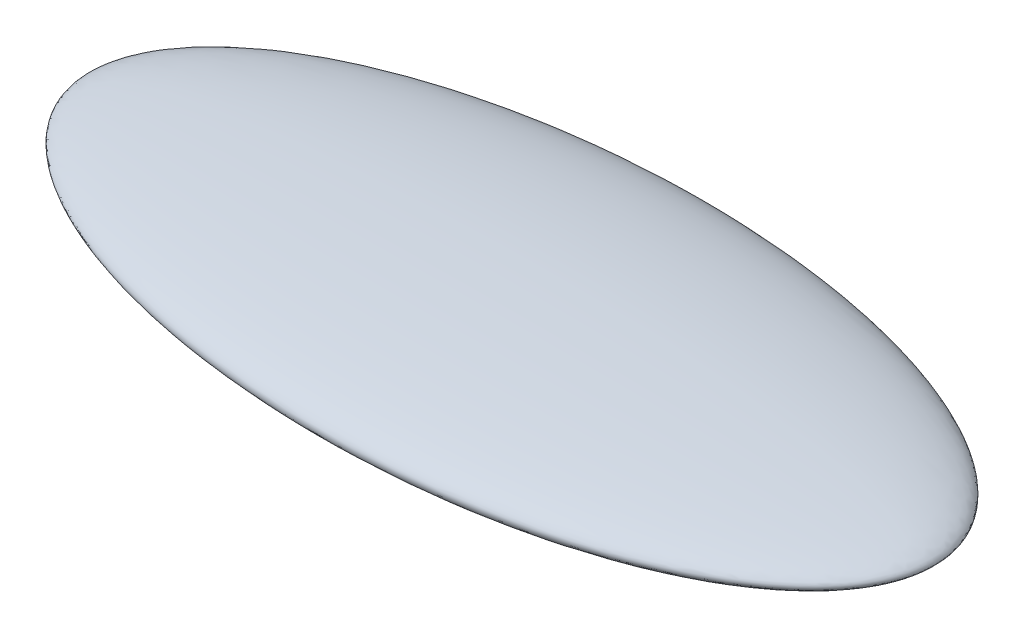
ISO-10303-21;
HEADER;
FILE_DESCRIPTION(('STEP AP214'),'2;1');
FILE_NAME('part.step','',(''),(''),'','','');
FILE_SCHEMA(('AUTOMOTIVE_DESIGN { 1 0 10303 214 1 1 1 1 }'));
ENDSEC;
DATA;
#1=APPLICATION_CONTEXT('core data for automotive mechanical design processes');
#2=APPLICATION_PROTOCOL_DEFINITION('international standard','automotive_design',2000,#1);
#3=PRODUCT_CONTEXT('',#1,'mechanical');
#4=PRODUCT('Part','Part','',(#3));
#5=PRODUCT_RELATED_PRODUCT_CATEGORY('part','',(#4));
#6=PRODUCT_DEFINITION_FORMATION('','',#4);
#7=PRODUCT_DEFINITION_CONTEXT('part definition',#1,'design');
#8=PRODUCT_DEFINITION('design','',#6,#7);
#9=PRODUCT_DEFINITION_SHAPE('','',#8);
#10=(LENGTH_UNIT() NAMED_UNIT(*) SI_UNIT(.MILLI.,.METRE.));
#11=(NAMED_UNIT(*) PLANE_ANGLE_UNIT() SI_UNIT($,.RADIAN.));
#12=(NAMED_UNIT(*) SI_UNIT($,.STERADIAN.) SOLID_ANGLE_UNIT());
#13=UNCERTAINTY_MEASURE_WITH_UNIT(LENGTH_MEASURE(1.E-05),#10,'distance_accuracy_value','');
#14=(GEOMETRIC_REPRESENTATION_CONTEXT(3) GLOBAL_UNCERTAINTY_ASSIGNED_CONTEXT((#13)) GLOBAL_UNIT_ASSIGNED_CONTEXT((#10,
#11,#12)) REPRESENTATION_CONTEXT('',''));
#15=CARTESIAN_POINT('',(0.,0.,0.));
#16=DIRECTION('',(0.,0.,1.));
#17=DIRECTION('',(1.,0.,0.));
#18=AXIS2_PLACEMENT_3D('',#15,#16,#17);
#19=CARTESIAN_POINT('',(0.,-46.5,88.));
#20=CARTESIAN_POINT('',(50.,-46.5,88.));
#21=CARTESIAN_POINT('',(50.,-46.5,111.));
#22=CARTESIAN_POINT('',(50.,-46.5,134.));
#23=CARTESIAN_POINT('',(0.,-46.5,134.));
#24=CARTESIAN_POINT('',(0.,-46.5,88.));
#25=CARTESIAN_POINT('',(50.,-39.225386608211,88.));
#26=CARTESIAN_POINT('',(50.,-39.225386608211,111.));
#27=CARTESIAN_POINT('',(50.,-39.225386608211,134.));
#28=CARTESIAN_POINT('',(0.,-46.5,134.));
#29=CARTESIAN_POINT('',(0.,-46.5,88.));
#30=CARTESIAN_POINT('',(-25.,-42.862693304105,88.));
#31=CARTESIAN_POINT('',(-25.,-42.862693304105,111.));
#32=CARTESIAN_POINT('',(-25.,-42.862693304105,134.));
#33=CARTESIAN_POINT('',(0.,-46.5,134.));
#34=CARTESIAN_POINT('',(0.,-46.5,88.));
#35=CARTESIAN_POINT('',(-100.,-46.5,88.));
#36=CARTESIAN_POINT('',(-100.,-46.5,111.));
#37=CARTESIAN_POINT('',(-100.,-46.5,134.));
#38=CARTESIAN_POINT('',(0.,-46.5,134.));
#39=CARTESIAN_POINT('',(0.,-46.5,88.));
#40=CARTESIAN_POINT('',(-25.,-50.137306695895,88.));
#41=CARTESIAN_POINT('',(-25.,-50.137306695895,111.));
#42=CARTESIAN_POINT('',(-25.,-50.137306695895,134.));
#43=CARTESIAN_POINT('',(0.,-46.5,134.));
#44=CARTESIAN_POINT('',(0.,-46.5,88.));
#45=CARTESIAN_POINT('',(50.,-53.774613391789,88.));
#46=CARTESIAN_POINT('',(50.,-53.774613391789,111.));
#47=CARTESIAN_POINT('',(50.,-53.774613391789,134.));
#48=CARTESIAN_POINT('',(0.,-46.5,134.));
#49=CARTESIAN_POINT('',(0.,-46.5,88.));
#50=CARTESIAN_POINT('',(50.,-46.5,88.));
#51=CARTESIAN_POINT('',(50.,-46.5,111.));
#52=CARTESIAN_POINT('',(50.,-46.5,134.));
#53=CARTESIAN_POINT('',(0.,-46.5,134.));
#54=(BOUNDED_SURFACE() B_SPLINE_SURFACE(2,2,((#19,#20,#21,#22,#23),(#24,#25,#26,#27,#28),(#29,
#30,#31,#32,#33),(#34,#35,#36,#37,#38),(#39,#40,#41,#42,#43),(#44,#45,#46,#47,#48),(#49,#50,#51,
#52,#53)),.UNSPECIFIED.,.T.,.F.,.F.) B_SPLINE_SURFACE_WITH_KNOTS((3,2,2,3),(3,2,3),(0.,
2.094395102393,4.188790204786,6.28318530718),(-1.570796326795,0.,1.570796326795),
.UNSPECIFIED.) GEOMETRIC_REPRESENTATION_ITEM() RATIONAL_B_SPLINE_SURFACE(((1.,0.707106781187,1.,
0.707106781187,1.),(0.5,0.353553390593,0.5,0.353553390593,0.5),(1.,0.707106781187,1.,
0.707106781187,1.),(0.5,0.353553390593,0.5,0.353553390593,0.5),(1.,0.707106781187,1.,
0.707106781187,1.),(0.5,0.353553390593,0.5,0.353553390593,0.5),(1.,0.707106781187,1.,
0.707106781187,1.))) REPRESENTATION_ITEM('') SURFACE());
#55=CARTESIAN_POINT('',(0.,-46.5,134.));
#56=VERTEX_POINT('',#55);
#57=VERTEX_LOOP('',#56);
#58=FACE_BOUND('',#57,.T.);
#59=CARTESIAN_POINT('',(0.,-46.5,88.));
#60=VERTEX_POINT('',#59);
#61=VERTEX_LOOP('',#60);
#62=FACE_BOUND('',#61,.T.);
#63=ADVANCED_FACE('F14',(#58,#62),#54,.T.);
#64=CLOSED_SHELL('',(#63));
#65=MANIFOLD_SOLID_BREP('B1',#64);
#66=ADVANCED_BREP_SHAPE_REPRESENTATION('',(#18,#65),#14);
#67=SHAPE_DEFINITION_REPRESENTATION(#9,#66);
ENDSEC;
END-ISO-10303-21;
